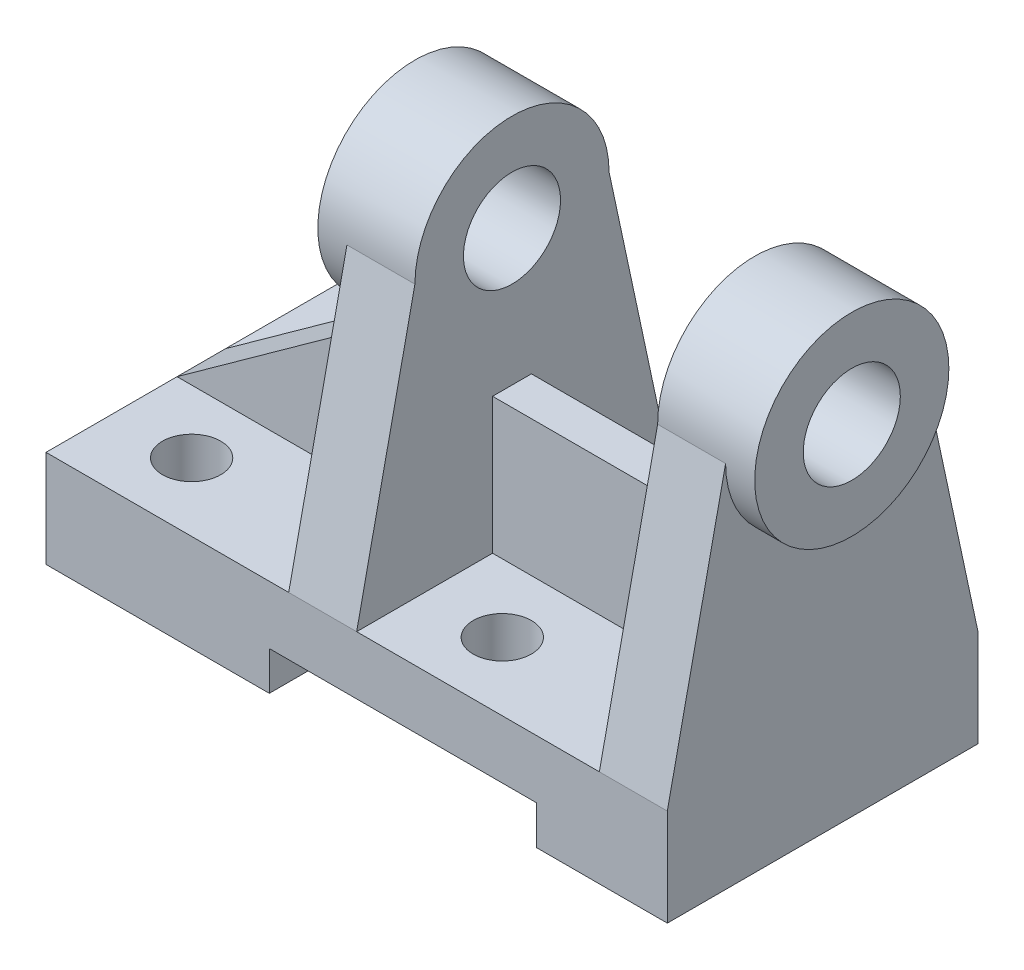
ISO-10303-21;
HEADER;
FILE_DESCRIPTION(('STEP AP214'),'2;1');
FILE_NAME('part.step','',(''),(''),'','','');
FILE_SCHEMA(('AUTOMOTIVE_DESIGN { 1 0 10303 214 1 1 1 1 }'));
ENDSEC;
DATA;
#1=APPLICATION_CONTEXT('core data for automotive mechanical design processes');
#2=APPLICATION_PROTOCOL_DEFINITION('international standard','automotive_design',2000,#1);
#3=PRODUCT_CONTEXT('',#1,'mechanical');
#4=PRODUCT('Part','Part','',(#3));
#5=PRODUCT_RELATED_PRODUCT_CATEGORY('part','',(#4));
#6=PRODUCT_DEFINITION_FORMATION('','',#4);
#7=PRODUCT_DEFINITION_CONTEXT('part definition',#1,'design');
#8=PRODUCT_DEFINITION('design','',#6,#7);
#9=PRODUCT_DEFINITION_SHAPE('','',#8);
#10=(LENGTH_UNIT() NAMED_UNIT(*) SI_UNIT(.MILLI.,.METRE.));
#11=(NAMED_UNIT(*) PLANE_ANGLE_UNIT() SI_UNIT($,.RADIAN.));
#12=(NAMED_UNIT(*) SI_UNIT($,.STERADIAN.) SOLID_ANGLE_UNIT());
#13=UNCERTAINTY_MEASURE_WITH_UNIT(LENGTH_MEASURE(1.E-05),#10,'distance_accuracy_value','');
#14=(GEOMETRIC_REPRESENTATION_CONTEXT(3) GLOBAL_UNCERTAINTY_ASSIGNED_CONTEXT((#13)) GLOBAL_UNIT_ASSIGNED_CONTEXT((#10,
#11,#12)) REPRESENTATION_CONTEXT('',''));
#15=CARTESIAN_POINT('',(0.,0.,0.));
#16=DIRECTION('',(0.,0.,1.));
#17=DIRECTION('',(1.,0.,0.));
#18=AXIS2_PLACEMENT_3D('',#15,#16,#17);
#19=CARTESIAN_POINT('',(0.,20.,0.));
#20=DIRECTION('',(0.,-1.,0.));
#21=DIRECTION('',(0.,0.,-1.));
#22=AXIS2_PLACEMENT_3D('',#19,#20,#21);
#23=PLANE('',#22);
#24=CARTESIAN_POINT('',(-48.,20.,-18.));
#25=DIRECTION('',(0.,1.,0.));
#26=DIRECTION('',(0.,0.,1.));
#27=AXIS2_PLACEMENT_3D('',#24,#25,#26);
#28=CIRCLE('',#27,6.);
#29=CARTESIAN_POINT('',(-48.,20.,-12.));
#30=VERTEX_POINT('',#29);
#31=EDGE_CURVE('E397',#30,#30,#28,.T.);
#32=ORIENTED_EDGE('',*,*,#31,.F.);
#33=EDGE_LOOP('',(#32));
#34=FACE_BOUND('',#33,.T.);
#35=DIRECTION('',(-1.,0.,0.));
#36=VECTOR('',#35,1.);
#37=CARTESIAN_POINT('',(0.,20.,-5.));
#38=LINE('',#37,#36);
#39=CARTESIAN_POINT('',(-14.,20.,-5.));
#40=VERTEX_POINT('',#39);
#41=CARTESIAN_POINT('',(-64.,20.,-5.));
#42=VERTEX_POINT('',#41);
#43=EDGE_CURVE('E188',#40,#42,#38,.T.);
#44=ORIENTED_EDGE('',*,*,#43,.F.);
#45=DIRECTION('',(0.,0.,1.));
#46=VECTOR('',#45,1.);
#47=CARTESIAN_POINT('',(-14.,20.,0.));
#48=LINE('',#47,#46);
#49=CARTESIAN_POINT('',(-14.,20.,-32.));
#50=VERTEX_POINT('',#49);
#51=EDGE_CURVE('E331',#50,#40,#48,.T.);
#52=ORIENTED_EDGE('',*,*,#51,.F.);
#53=DIRECTION('',(-1.,0.,0.));
#54=VECTOR('',#53,1.);
#55=CARTESIAN_POINT('',(-64.,20.,-32.));
#56=LINE('',#55,#54);
#57=CARTESIAN_POINT('',(-64.,20.,-32.));
#58=VERTEX_POINT('',#57);
#59=EDGE_CURVE('E219',#50,#58,#56,.T.);
#60=ORIENTED_EDGE('',*,*,#59,.T.);
#61=DIRECTION('',(0.,0.,1.));
#62=VECTOR('',#61,1.);
#63=CARTESIAN_POINT('',(-64.,20.,32.));
#64=LINE('',#63,#62);
#65=EDGE_CURVE('E213',#58,#42,#64,.T.);
#66=ORIENTED_EDGE('',*,*,#65,.T.);
#67=EDGE_LOOP('',(#44,#52,#60,#66));
#68=FACE_BOUND('',#67,.T.);
#69=ADVANCED_FACE('F37',(#34,#68),#23,.F.);
#70=CARTESIAN_POINT('',(-14.,0.,0.));
#71=DIRECTION('',(-1.,0.,0.));
#72=DIRECTION('',(0.,0.,-1.));
#73=AXIS2_PLACEMENT_3D('',#70,#71,#72);
#74=PLANE('',#73);
#75=DIRECTION('',(0.,1.,0.));
#76=VECTOR('',#75,1.);
#77=CARTESIAN_POINT('',(-14.,0.,5.));
#78=LINE('',#77,#76);
#79=CARTESIAN_POINT('',(-14.,20.,5.));
#80=VERTEX_POINT('',#79);
#81=CARTESIAN_POINT('',(-14.,56.,5.));
#82=VERTEX_POINT('',#81);
#83=EDGE_CURVE('E11',#80,#82,#78,.T.);
#84=ORIENTED_EDGE('',*,*,#83,.F.);
#85=CARTESIAN_POINT('',(-14.,20.,32.));
#86=VERTEX_POINT('',#85);
#87=EDGE_CURVE('E333',#80,#86,#48,.T.);
#88=ORIENTED_EDGE('',*,*,#87,.T.);
#89=DIRECTION('',(0.,-0.97780241407741,0.209529088730873));
#90=VECTOR('',#89,1.);
#91=CARTESIAN_POINT('',(-14.,7.43414634146341,34.6926829268293));
#92=LINE('',#91,#90);
#93=CARTESIAN_POINT('',(-14.,76.,20.));
#94=VERTEX_POINT('',#93);
#95=EDGE_CURVE('E327',#94,#86,#92,.T.);
#96=ORIENTED_EDGE('',*,*,#95,.F.);
#97=CARTESIAN_POINT('',(-14.,76.,0.));
#98=DIRECTION('',(-1.,0.,0.));
#99=DIRECTION('',(0.,0.,1.));
#100=AXIS2_PLACEMENT_3D('',#97,#98,#99);
#101=CIRCLE('',#100,20.);
#102=CARTESIAN_POINT('',(-14.,56.,0.));
#103=VERTEX_POINT('',#102);
#104=EDGE_CURVE('E249',#103,#94,#101,.T.);
#105=ORIENTED_EDGE('',*,*,#104,.F.);
#106=DIRECTION('',(0.,0.,1.));
#107=VECTOR('',#106,1.);
#108=CARTESIAN_POINT('',(-14.,56.,0.));
#109=LINE('',#108,#107);
#110=EDGE_CURVE('E46',#82,#103,#109,.F.);
#111=ORIENTED_EDGE('',*,*,#110,.F.);
#112=EDGE_LOOP('',(#84,#88,#96,#105,#111));
#113=FACE_BOUND('',#112,.T.);
#114=ADVANCED_FACE('F414',(#113),#74,.T.);
#115=CARTESIAN_POINT('',(16.,20.,-18.));
#116=DIRECTION('',(0.,1.,0.));
#117=DIRECTION('',(0.,0.,1.));
#118=AXIS2_PLACEMENT_3D('',#115,#116,#117);
#119=CIRCLE('',#118,6.);
#120=CARTESIAN_POINT('',(16.,20.,-12.));
#121=VERTEX_POINT('',#120);
#122=EDGE_CURVE('E387',#121,#121,#119,.T.);
#123=ORIENTED_EDGE('',*,*,#122,.F.);
#124=EDGE_LOOP('',(#123));
#125=FACE_BOUND('',#124,.T.);
#126=DIRECTION('',(-1.,0.,0.));
#127=VECTOR('',#126,1.);
#128=CARTESIAN_POINT('',(0.,20.,-4.));
#129=LINE('',#128,#127);
#130=CARTESIAN_POINT('',(50.,20.,-4.));
#131=VERTEX_POINT('',#130);
#132=CARTESIAN_POINT('',(0.,20.,-4.));
#133=VERTEX_POINT('',#132);
#134=EDGE_CURVE('E216',#131,#133,#129,.T.);
#135=ORIENTED_EDGE('',*,*,#134,.F.);
#136=DIRECTION('',(0.,0.,1.));
#137=VECTOR('',#136,1.);
#138=CARTESIAN_POINT('',(50.,20.,0.));
#139=LINE('',#138,#137);
#140=CARTESIAN_POINT('',(50.,20.,-32.));
#141=VERTEX_POINT('',#140);
#142=EDGE_CURVE('E253',#141,#131,#139,.T.);
#143=ORIENTED_EDGE('',*,*,#142,.F.);
#144=CARTESIAN_POINT('',(0.,20.,-32.));
#145=VERTEX_POINT('',#144);
#146=EDGE_CURVE('E244',#141,#145,#56,.T.);
#147=ORIENTED_EDGE('',*,*,#146,.T.);
#148=DIRECTION('',(0.,0.,1.));
#149=VECTOR('',#148,1.);
#150=CARTESIAN_POINT('',(0.,20.,0.));
#151=LINE('',#150,#149);
#152=EDGE_CURVE('E345',#145,#133,#151,.T.);
#153=ORIENTED_EDGE('',*,*,#152,.T.);
#154=EDGE_LOOP('',(#135,#143,#147,#153));
#155=FACE_BOUND('',#154,.T.);
#156=ADVANCED_FACE('F416',(#125,#155),#23,.F.);
#157=CARTESIAN_POINT('',(16.,20.,18.));
#158=DIRECTION('',(0.,1.,0.));
#159=DIRECTION('',(0.,0.,1.));
#160=AXIS2_PLACEMENT_3D('',#157,#158,#159);
#161=CIRCLE('',#160,6.);
#162=CARTESIAN_POINT('',(16.,20.,24.));
#163=VERTEX_POINT('',#162);
#164=EDGE_CURVE('E384',#163,#163,#161,.T.);
#165=ORIENTED_EDGE('',*,*,#164,.F.);
#166=EDGE_LOOP('',(#165));
#167=FACE_BOUND('',#166,.T.);
#168=DIRECTION('',(1.,0.,0.));
#169=VECTOR('',#168,1.);
#170=CARTESIAN_POINT('',(-64.,20.,32.));
#171=LINE('',#170,#169);
#172=CARTESIAN_POINT('',(0.,20.,32.));
#173=VERTEX_POINT('',#172);
#174=CARTESIAN_POINT('',(50.,20.,32.));
#175=VERTEX_POINT('',#174);
#176=EDGE_CURVE('E221',#173,#175,#171,.T.);
#177=ORIENTED_EDGE('',*,*,#176,.T.);
#178=CARTESIAN_POINT('',(50.,20.,4.));
#179=VERTEX_POINT('',#178);
#180=EDGE_CURVE('E250',#179,#175,#139,.T.);
#181=ORIENTED_EDGE('',*,*,#180,.F.);
#182=DIRECTION('',(1.,0.,0.));
#183=VECTOR('',#182,1.);
#184=CARTESIAN_POINT('',(0.,20.,4.));
#185=LINE('',#184,#183);
#186=CARTESIAN_POINT('',(0.,20.,4.));
#187=VERTEX_POINT('',#186);
#188=EDGE_CURVE('E365',#187,#179,#185,.T.);
#189=ORIENTED_EDGE('',*,*,#188,.F.);
#190=EDGE_CURVE('E347',#187,#173,#151,.T.);
#191=ORIENTED_EDGE('',*,*,#190,.T.);
#192=EDGE_LOOP('',(#177,#181,#189,#191));
#193=FACE_BOUND('',#192,.T.);
#194=ADVANCED_FACE('F427',(#167,#193),#23,.F.);
#195=CARTESIAN_POINT('',(50.,0.,0.));
#196=DIRECTION('',(1.,0.,0.));
#197=DIRECTION('',(0.,0.,-1.));
#198=AXIS2_PLACEMENT_3D('',#195,#196,#197);
#199=PLANE('',#198);
#200=CARTESIAN_POINT('',(50.,76.,0.));
#201=DIRECTION('',(1.,0.,0.));
#202=DIRECTION('',(0.,0.,-1.));
#203=AXIS2_PLACEMENT_3D('',#200,#201,#202);
#204=CIRCLE('',#203,10.);
#205=CARTESIAN_POINT('',(50.,76.,-10.));
#206=VERTEX_POINT('',#205);
#207=EDGE_CURVE('E261',#206,#206,#204,.T.);
#208=ORIENTED_EDGE('',*,*,#207,.T.);
#209=EDGE_LOOP('',(#208));
#210=FACE_BOUND('',#209,.T.);
#211=DIRECTION('',(0.,-0.97780241407741,0.209529088730873));
#212=VECTOR('',#211,1.);
#213=CARTESIAN_POINT('',(50.,7.43414634146341,34.6926829268293));
#214=LINE('',#213,#212);
#215=CARTESIAN_POINT('',(50.,76.,20.));
#216=VERTEX_POINT('',#215);
#217=EDGE_CURVE('E254',#216,#175,#214,.T.);
#218=ORIENTED_EDGE('',*,*,#217,.F.);
#219=CARTESIAN_POINT('',(50.,76.,0.));
#220=DIRECTION('',(1.,0.,0.));
#221=DIRECTION('',(0.,0.,-1.));
#222=AXIS2_PLACEMENT_3D('',#219,#220,#221);
#223=CIRCLE('',#222,20.);
#224=CARTESIAN_POINT('',(50.,76.,-20.));
#225=VERTEX_POINT('',#224);
#226=EDGE_CURVE('E259',#225,#216,#223,.T.);
#227=ORIENTED_EDGE('',*,*,#226,.F.);
#228=DIRECTION('',(0.,-0.97780241407741,-0.209529088730873));
#229=VECTOR('',#228,1.);
#230=CARTESIAN_POINT('',(50.,7.43414634146341,-34.6926829268293));
#231=LINE('',#230,#229);
#232=EDGE_CURVE('E276',#225,#141,#231,.T.);
#233=ORIENTED_EDGE('',*,*,#232,.T.);
#234=ORIENTED_EDGE('',*,*,#142,.T.);
#235=DIRECTION('',(0.,-1.,0.));
#236=VECTOR('',#235,1.);
#237=CARTESIAN_POINT('',(50.,48.,-4.));
#238=LINE('',#237,#236);
#239=CARTESIAN_POINT('',(50.,48.,-4.));
#240=VERTEX_POINT('',#239);
#241=EDGE_CURVE('E62',#240,#131,#238,.T.);
#242=ORIENTED_EDGE('',*,*,#241,.F.);
#243=DIRECTION('',(0.,0.,-1.));
#244=VECTOR('',#243,1.);
#245=CARTESIAN_POINT('',(50.,48.,4.));
#246=LINE('',#245,#244);
#247=CARTESIAN_POINT('',(50.,48.,4.));
#248=VERTEX_POINT('',#247);
#249=EDGE_CURVE('E368',#248,#240,#246,.T.);
#250=ORIENTED_EDGE('',*,*,#249,.F.);
#251=DIRECTION('',(0.,-1.,0.));
#252=VECTOR('',#251,1.);
#253=CARTESIAN_POINT('',(50.,48.,4.));
#254=LINE('',#253,#252);
#255=EDGE_CURVE('E362',#248,#179,#254,.T.);
#256=ORIENTED_EDGE('',*,*,#255,.T.);
#257=ORIENTED_EDGE('',*,*,#180,.T.);
#258=EDGE_LOOP('',(#218,#227,#233,#234,#242,#250,#256,#257));
#259=FACE_BOUND('',#258,.T.);
#260=ADVANCED_FACE('F441',(#210,#259),#199,.F.);
#261=CARTESIAN_POINT('',(0.,0.,0.));
#262=DIRECTION('',(-1.,0.,0.));
#263=DIRECTION('',(0.,0.,-1.));
#264=AXIS2_PLACEMENT_3D('',#261,#262,#263);
#265=PLANE('',#264);
#266=CARTESIAN_POINT('',(0.,76.,0.));
#267=DIRECTION('',(1.,0.,0.));
#268=DIRECTION('',(0.,0.,-1.));
#269=AXIS2_PLACEMENT_3D('',#266,#267,#268);
#270=CIRCLE('',#269,10.);
#271=CARTESIAN_POINT('',(0.,76.,-10.));
#272=VERTEX_POINT('',#271);
#273=EDGE_CURVE('E319',#272,#272,#270,.T.);
#274=ORIENTED_EDGE('',*,*,#273,.F.);
#275=EDGE_LOOP('',(#274));
#276=FACE_BOUND('',#275,.T.);
#277=DIRECTION('',(0.,-0.97780241407741,0.209529088730873));
#278=VECTOR('',#277,1.);
#279=CARTESIAN_POINT('',(0.,7.43414634146341,34.6926829268293));
#280=LINE('',#279,#278);
#281=CARTESIAN_POINT('',(0.,76.,20.));
#282=VERTEX_POINT('',#281);
#283=EDGE_CURVE('E342',#282,#173,#280,.T.);
#284=ORIENTED_EDGE('',*,*,#283,.T.);
#285=ORIENTED_EDGE('',*,*,#190,.F.);
#286=DIRECTION('',(0.,-1.,0.));
#287=VECTOR('',#286,1.);
#288=CARTESIAN_POINT('',(0.,48.,4.));
#289=LINE('',#288,#287);
#290=CARTESIAN_POINT('',(0.,48.,4.));
#291=VERTEX_POINT('',#290);
#292=EDGE_CURVE('E359',#291,#187,#289,.T.);
#293=ORIENTED_EDGE('',*,*,#292,.F.);
#294=DIRECTION('',(0.,0.,1.));
#295=VECTOR('',#294,1.);
#296=CARTESIAN_POINT('',(0.,48.,4.));
#297=LINE('',#296,#295);
#298=CARTESIAN_POINT('',(0.,48.,-4.));
#299=VERTEX_POINT('',#298);
#300=EDGE_CURVE('E373',#299,#291,#297,.T.);
#301=ORIENTED_EDGE('',*,*,#300,.F.);
#302=DIRECTION('',(0.,-1.,0.));
#303=VECTOR('',#302,1.);
#304=CARTESIAN_POINT('',(0.,48.,-4.));
#305=LINE('',#304,#303);
#306=EDGE_CURVE('E356',#299,#133,#305,.T.);
#307=ORIENTED_EDGE('',*,*,#306,.T.);
#308=ORIENTED_EDGE('',*,*,#152,.F.);
#309=DIRECTION('',(0.,-0.97780241407741,-0.209529088730873));
#310=VECTOR('',#309,1.);
#311=CARTESIAN_POINT('',(0.,7.43414634146341,-34.6926829268293));
#312=LINE('',#311,#310);
#313=CARTESIAN_POINT('',(0.,76.,-20.));
#314=VERTEX_POINT('',#313);
#315=EDGE_CURVE('E330',#314,#145,#312,.T.);
#316=ORIENTED_EDGE('',*,*,#315,.F.);
#317=CARTESIAN_POINT('',(0.,76.,0.));
#318=DIRECTION('',(1.,0.,0.));
#319=DIRECTION('',(0.,0.,-1.));
#320=AXIS2_PLACEMENT_3D('',#317,#318,#319);
#321=CIRCLE('',#320,20.);
#322=EDGE_CURVE('E340',#314,#282,#321,.T.);
#323=ORIENTED_EDGE('',*,*,#322,.T.);
#324=EDGE_LOOP('',(#284,#285,#293,#301,#307,#308,#316,#323));
#325=FACE_BOUND('',#324,.T.);
#326=ADVANCED_FACE('F437',(#276,#325),#265,.F.);
#327=CARTESIAN_POINT('',(64.,20.,32.));
#328=DIRECTION('',(-1.,0.,0.));
#329=DIRECTION('',(0.,0.,1.));
#330=AXIS2_PLACEMENT_3D('',#327,#328,#329);
#331=PLANE('',#330);
#332=DIRECTION('',(0.,0.,-1.));
#333=VECTOR('',#332,1.);
#334=CARTESIAN_POINT('',(64.,0.,32.));
#335=LINE('',#334,#333);
#336=CARTESIAN_POINT('',(64.,0.,32.));
#337=VERTEX_POINT('',#336);
#338=CARTESIAN_POINT('',(64.,0.,-32.));
#339=VERTEX_POINT('',#338);
#340=EDGE_CURVE('E233',#337,#339,#335,.T.);
#341=ORIENTED_EDGE('',*,*,#340,.T.);
#342=DIRECTION('',(0.,-1.,0.));
#343=VECTOR('',#342,1.);
#344=CARTESIAN_POINT('',(64.,20.,-32.));
#345=LINE('',#344,#343);
#346=CARTESIAN_POINT('',(64.,20.,-32.));
#347=VERTEX_POINT('',#346);
#348=EDGE_CURVE('E290',#347,#339,#345,.T.);
#349=ORIENTED_EDGE('',*,*,#348,.F.);
#350=DIRECTION('',(0.,-0.97780241407741,-0.209529088730873));
#351=VECTOR('',#350,1.);
#352=CARTESIAN_POINT('',(64.,7.43414634146341,-34.6926829268293));
#353=LINE('',#352,#351);
#354=CARTESIAN_POINT('',(64.,76.,-20.));
#355=VERTEX_POINT('',#354);
#356=EDGE_CURVE('E284',#355,#347,#353,.T.);
#357=ORIENTED_EDGE('',*,*,#356,.F.);
#358=CARTESIAN_POINT('',(64.,76.,0.));
#359=DIRECTION('',(1.,0.,0.));
#360=DIRECTION('',(0.,0.,-1.));
#361=AXIS2_PLACEMENT_3D('',#358,#359,#360);
#362=CIRCLE('',#361,20.);
#363=CARTESIAN_POINT('',(64.,76.,20.));
#364=VERTEX_POINT('',#363);
#365=EDGE_CURVE('E287',#364,#355,#362,.T.);
#366=ORIENTED_EDGE('',*,*,#365,.F.);
#367=DIRECTION('',(0.,-0.97780241407741,0.209529088730873));
#368=VECTOR('',#367,1.);
#369=CARTESIAN_POINT('',(64.,7.43414634146341,34.6926829268293));
#370=LINE('',#369,#368);
#371=CARTESIAN_POINT('',(64.,20.,32.));
#372=VERTEX_POINT('',#371);
#373=EDGE_CURVE('E279',#364,#372,#370,.T.);
#374=ORIENTED_EDGE('',*,*,#373,.T.);
#375=DIRECTION('',(0.,-1.,0.));
#376=VECTOR('',#375,1.);
#377=CARTESIAN_POINT('',(64.,20.,32.));
#378=LINE('',#377,#376);
#379=EDGE_CURVE('E457',#372,#337,#378,.T.);
#380=ORIENTED_EDGE('',*,*,#379,.T.);
#381=EDGE_LOOP('',(#341,#349,#357,#366,#374,#380));
#382=FACE_BOUND('',#381,.T.);
#383=ADVANCED_FACE('F39',(#382),#331,.F.);
#384=CARTESIAN_POINT('',(-48.,20.,18.));
#385=DIRECTION('',(0.,1.,0.));
#386=DIRECTION('',(0.,0.,1.));
#387=AXIS2_PLACEMENT_3D('',#384,#385,#386);
#388=CIRCLE('',#387,6.);
#389=CARTESIAN_POINT('',(-48.,20.,24.));
#390=VERTEX_POINT('',#389);
#391=EDGE_CURVE('E391',#390,#390,#388,.T.);
#392=ORIENTED_EDGE('',*,*,#391,.F.);
#393=EDGE_LOOP('',(#392));
#394=FACE_BOUND('',#393,.T.);
#395=ORIENTED_EDGE('',*,*,#87,.F.);
#396=DIRECTION('',(-1.,0.,0.));
#397=VECTOR('',#396,1.);
#398=CARTESIAN_POINT('',(0.,20.,5.));
#399=LINE('',#398,#397);
#400=CARTESIAN_POINT('',(-64.,20.,5.));
#401=VERTEX_POINT('',#400);
#402=EDGE_CURVE('E195',#80,#401,#399,.T.);
#403=ORIENTED_EDGE('',*,*,#402,.T.);
#404=CARTESIAN_POINT('',(-64.,20.,32.));
#405=VERTEX_POINT('',#404);
#406=EDGE_CURVE('E215',#401,#405,#64,.T.);
#407=ORIENTED_EDGE('',*,*,#406,.T.);
#408=EDGE_CURVE('E224',#405,#86,#171,.T.);
#409=ORIENTED_EDGE('',*,*,#408,.T.);
#410=EDGE_LOOP('',(#395,#403,#407,#409));
#411=FACE_BOUND('',#410,.T.);
#412=ADVANCED_FACE('F417',(#394,#411),#23,.F.);
#413=CARTESIAN_POINT('',(0.,0.,0.));
#414=DIRECTION('',(0.,-1.,0.));
#415=DIRECTION('',(0.,0.,-1.));
#416=AXIS2_PLACEMENT_3D('',#413,#414,#415);
#417=PLANE('',#416);
#418=CARTESIAN_POINT('',(-48.,0.,-18.));
#419=DIRECTION('',(0.,1.,0.));
#420=DIRECTION('',(0.,0.,1.));
#421=AXIS2_PLACEMENT_3D('',#418,#419,#420);
#422=CIRCLE('',#421,6.);
#423=CARTESIAN_POINT('',(-48.,0.,-12.));
#424=VERTEX_POINT('',#423);
#425=EDGE_CURVE('E394',#424,#424,#422,.T.);
#426=ORIENTED_EDGE('',*,*,#425,.T.);
#427=EDGE_LOOP('',(#426));
#428=FACE_BOUND('',#427,.T.);
#429=CARTESIAN_POINT('',(-48.,0.,18.));
#430=DIRECTION('',(0.,1.,0.));
#431=DIRECTION('',(0.,0.,1.));
#432=AXIS2_PLACEMENT_3D('',#429,#430,#431);
#433=CIRCLE('',#432,6.);
#434=CARTESIAN_POINT('',(-48.,0.,24.));
#435=VERTEX_POINT('',#434);
#436=EDGE_CURVE('E390',#435,#435,#433,.T.);
#437=ORIENTED_EDGE('',*,*,#436,.T.);
#438=EDGE_LOOP('',(#437));
#439=FACE_BOUND('',#438,.T.);
#440=DIRECTION('',(1.,0.,0.));
#441=VECTOR('',#440,1.);
#442=CARTESIAN_POINT('',(-64.,0.,32.));
#443=LINE('',#442,#441);
#444=CARTESIAN_POINT('',(-64.,0.,32.));
#445=VERTEX_POINT('',#444);
#446=CARTESIAN_POINT('',(-18.,0.,32.));
#447=VERTEX_POINT('',#446);
#448=EDGE_CURVE('E245',#445,#447,#443,.T.);
#449=ORIENTED_EDGE('',*,*,#448,.F.);
#450=DIRECTION('',(0.,0.,1.));
#451=VECTOR('',#450,1.);
#452=CARTESIAN_POINT('',(-64.,0.,32.));
#453=LINE('',#452,#451);
#454=CARTESIAN_POINT('',(-64.,0.,-32.));
#455=VERTEX_POINT('',#454);
#456=EDGE_CURVE('E508',#455,#445,#453,.T.);
#457=ORIENTED_EDGE('',*,*,#456,.F.);
#458=DIRECTION('',(-1.,0.,0.));
#459=VECTOR('',#458,1.);
#460=CARTESIAN_POINT('',(-64.,0.,-32.));
#461=LINE('',#460,#459);
#462=CARTESIAN_POINT('',(-18.,0.,-32.));
#463=VERTEX_POINT('',#462);
#464=EDGE_CURVE('E502',#463,#455,#461,.T.);
#465=ORIENTED_EDGE('',*,*,#464,.F.);
#466=DIRECTION('',(0.,0.,1.));
#467=VECTOR('',#466,1.);
#468=CARTESIAN_POINT('',(-18.,0.,-32.));
#469=LINE('',#468,#467);
#470=EDGE_CURVE('E517',#463,#447,#469,.T.);
#471=ORIENTED_EDGE('',*,*,#470,.T.);
#472=EDGE_LOOP('',(#449,#457,#465,#471));
#473=FACE_BOUND('',#472,.T.);
#474=ADVANCED_FACE('F403',(#428,#439,#473),#417,.T.);
#475=CARTESIAN_POINT('',(-64.,20.,-32.));
#476=DIRECTION('',(0.,0.,1.));
#477=DIRECTION('',(1.,0.,0.));
#478=AXIS2_PLACEMENT_3D('',#475,#476,#477);
#479=PLANE('',#478);
#480=DIRECTION('',(-1.,0.,0.));
#481=VECTOR('',#480,1.);
#482=CARTESIAN_POINT('',(-18.,8.,-32.));
#483=LINE('',#482,#481);
#484=CARTESIAN_POINT('',(37.,8.,-32.));
#485=VERTEX_POINT('',#484);
#486=CARTESIAN_POINT('',(-18.,8.,-32.));
#487=VERTEX_POINT('',#486);
#488=EDGE_CURVE('E535',#485,#487,#483,.T.);
#489=ORIENTED_EDGE('',*,*,#488,.T.);
#490=DIRECTION('',(0.,-1.,0.));
#491=VECTOR('',#490,1.);
#492=CARTESIAN_POINT('',(-18.,0.,-32.));
#493=LINE('',#492,#491);
#494=EDGE_CURVE('E513',#487,#463,#493,.T.);
#495=ORIENTED_EDGE('',*,*,#494,.T.);
#496=ORIENTED_EDGE('',*,*,#464,.T.);
#497=DIRECTION('',(0.,-1.,0.));
#498=VECTOR('',#497,1.);
#499=CARTESIAN_POINT('',(-64.,20.,-32.));
#500=LINE('',#499,#498);
#501=EDGE_CURVE('E483',#58,#455,#500,.T.);
#502=ORIENTED_EDGE('',*,*,#501,.F.);
#503=ORIENTED_EDGE('',*,*,#59,.F.);
#504=DIRECTION('',(-1.,0.,0.));
#505=VECTOR('',#504,1.);
#506=CARTESIAN_POINT('',(0.,20.,-32.));
#507=LINE('',#506,#505);
#508=EDGE_CURVE('E315',#145,#50,#507,.T.);
#509=ORIENTED_EDGE('',*,*,#508,.F.);
#510=ORIENTED_EDGE('',*,*,#146,.F.);
#511=EDGE_CURVE('E226',#347,#141,#56,.T.);
#512=ORIENTED_EDGE('',*,*,#511,.F.);
#513=ORIENTED_EDGE('',*,*,#348,.T.);
#514=CARTESIAN_POINT('',(37.,0.,-32.));
#515=VERTEX_POINT('',#514);
#516=EDGE_CURVE('E505',#339,#515,#461,.T.);
#517=ORIENTED_EDGE('',*,*,#516,.T.);
#518=DIRECTION('',(0.,1.,0.));
#519=VECTOR('',#518,1.);
#520=CARTESIAN_POINT('',(37.,0.,-32.));
#521=LINE('',#520,#519);
#522=EDGE_CURVE('E536',#515,#485,#521,.T.);
#523=ORIENTED_EDGE('',*,*,#522,.T.);
#524=EDGE_LOOP('',(#489,#495,#496,#502,#503,#509,#510,#512,#513,#517,#523));
#525=FACE_BOUND('',#524,.T.);
#526=ADVANCED_FACE('F435',(#525),#479,.F.);
#527=CARTESIAN_POINT('',(-64.,20.,32.));
#528=DIRECTION('',(1.,0.,0.));
#529=DIRECTION('',(0.,0.,-1.));
#530=AXIS2_PLACEMENT_3D('',#527,#528,#529);
#531=PLANE('',#530);
#532=ORIENTED_EDGE('',*,*,#406,.F.);
#533=DIRECTION('',(0.,0.,-1.));
#534=VECTOR('',#533,1.);
#535=CARTESIAN_POINT('',(-64.,20.,32.));
#536=LINE('',#535,#534);
#537=EDGE_CURVE('E202',#42,#401,#536,.F.);
#538=ORIENTED_EDGE('',*,*,#537,.F.);
#539=ORIENTED_EDGE('',*,*,#65,.F.);
#540=ORIENTED_EDGE('',*,*,#501,.T.);
#541=ORIENTED_EDGE('',*,*,#456,.T.);
#542=DIRECTION('',(0.,-1.,0.));
#543=VECTOR('',#542,1.);
#544=CARTESIAN_POINT('',(-64.,20.,32.));
#545=LINE('',#544,#543);
#546=EDGE_CURVE('E480',#405,#445,#545,.T.);
#547=ORIENTED_EDGE('',*,*,#546,.F.);
#548=EDGE_LOOP('',(#532,#538,#539,#540,#541,#547));
#549=FACE_BOUND('',#548,.T.);
#550=ADVANCED_FACE('F211',(#549),#531,.F.);
#551=CARTESIAN_POINT('',(-64.,20.,32.));
#552=DIRECTION('',(0.,0.,-1.));
#553=DIRECTION('',(-1.,0.,0.));
#554=AXIS2_PLACEMENT_3D('',#551,#552,#553);
#555=PLANE('',#554);
#556=ORIENTED_EDGE('',*,*,#448,.T.);
#557=DIRECTION('',(0.,-1.,0.));
#558=VECTOR('',#557,1.);
#559=CARTESIAN_POINT('',(-18.,0.,32.));
#560=LINE('',#559,#558);
#561=CARTESIAN_POINT('',(-18.,8.,32.));
#562=VERTEX_POINT('',#561);
#563=EDGE_CURVE('E268',#562,#447,#560,.T.);
#564=ORIENTED_EDGE('',*,*,#563,.F.);
#565=DIRECTION('',(-1.,0.,0.));
#566=VECTOR('',#565,1.);
#567=CARTESIAN_POINT('',(-18.,8.,32.));
#568=LINE('',#567,#566);
#569=CARTESIAN_POINT('',(37.,8.,32.));
#570=VERTEX_POINT('',#569);
#571=EDGE_CURVE('E525',#570,#562,#568,.T.);
#572=ORIENTED_EDGE('',*,*,#571,.F.);
#573=DIRECTION('',(0.,1.,0.));
#574=VECTOR('',#573,1.);
#575=CARTESIAN_POINT('',(37.,0.,32.));
#576=LINE('',#575,#574);
#577=CARTESIAN_POINT('',(37.,0.,32.));
#578=VERTEX_POINT('',#577);
#579=EDGE_CURVE('E523',#578,#570,#576,.T.);
#580=ORIENTED_EDGE('',*,*,#579,.F.);
#581=EDGE_CURVE('E509',#578,#337,#443,.T.);
#582=ORIENTED_EDGE('',*,*,#581,.T.);
#583=ORIENTED_EDGE('',*,*,#379,.F.);
#584=DIRECTION('',(1.,0.,0.));
#585=VECTOR('',#584,1.);
#586=CARTESIAN_POINT('',(50.,20.,32.));
#587=LINE('',#586,#585);
#588=EDGE_CURVE('E265',#175,#372,#587,.T.);
#589=ORIENTED_EDGE('',*,*,#588,.F.);
#590=ORIENTED_EDGE('',*,*,#176,.F.);
#591=DIRECTION('',(-1.,0.,0.));
#592=VECTOR('',#591,1.);
#593=CARTESIAN_POINT('',(0.,20.,32.));
#594=LINE('',#593,#592);
#595=EDGE_CURVE('E318',#173,#86,#594,.T.);
#596=ORIENTED_EDGE('',*,*,#595,.T.);
#597=ORIENTED_EDGE('',*,*,#408,.F.);
#598=ORIENTED_EDGE('',*,*,#546,.T.);
#599=EDGE_LOOP('',(#556,#564,#572,#580,#582,#583,#589,#590,#596,#597,#598));
#600=FACE_BOUND('',#599,.T.);
#601=ADVANCED_FACE('F456',(#600),#555,.F.);
#602=ORIENTED_EDGE('',*,*,#581,.F.);
#603=DIRECTION('',(0.,0.,1.));
#604=VECTOR('',#603,1.);
#605=CARTESIAN_POINT('',(37.,0.,-32.));
#606=LINE('',#605,#604);
#607=EDGE_CURVE('E506',#515,#578,#606,.T.);
#608=ORIENTED_EDGE('',*,*,#607,.F.);
#609=ORIENTED_EDGE('',*,*,#516,.F.);
#610=ORIENTED_EDGE('',*,*,#340,.F.);
#611=EDGE_LOOP('',(#602,#608,#609,#610));
#612=FACE_BOUND('',#611,.T.);
#613=ADVANCED_FACE('F436',(#612),#417,.T.);
#614=CARTESIAN_POINT('',(-18.,0.,-32.));
#615=DIRECTION('',(-1.,0.,0.));
#616=DIRECTION('',(0.,0.,1.));
#617=AXIS2_PLACEMENT_3D('',#614,#615,#616);
#618=PLANE('',#617);
#619=ORIENTED_EDGE('',*,*,#563,.T.);
#620=ORIENTED_EDGE('',*,*,#470,.F.);
#621=ORIENTED_EDGE('',*,*,#494,.F.);
#622=DIRECTION('',(0.,0.,1.));
#623=VECTOR('',#622,1.);
#624=CARTESIAN_POINT('',(-18.,8.,-32.));
#625=LINE('',#624,#623);
#626=EDGE_CURVE('E503',#487,#562,#625,.T.);
#627=ORIENTED_EDGE('',*,*,#626,.T.);
#628=EDGE_LOOP('',(#619,#620,#621,#627));
#629=FACE_BOUND('',#628,.T.);
#630=ADVANCED_FACE('F543',(#629),#618,.F.);
#631=CARTESIAN_POINT('',(-18.,8.,-32.));
#632=DIRECTION('',(0.,1.,0.));
#633=DIRECTION('',(0.,0.,1.));
#634=AXIS2_PLACEMENT_3D('',#631,#632,#633);
#635=PLANE('',#634);
#636=CARTESIAN_POINT('',(16.,8.,-18.));
#637=DIRECTION('',(0.,1.,0.));
#638=DIRECTION('',(0.,0.,1.));
#639=AXIS2_PLACEMENT_3D('',#636,#637,#638);
#640=CIRCLE('',#639,6.);
#641=CARTESIAN_POINT('',(16.,8.,-12.));
#642=VERTEX_POINT('',#641);
#643=EDGE_CURVE('E41',#642,#642,#640,.T.);
#644=ORIENTED_EDGE('',*,*,#643,.T.);
#645=EDGE_LOOP('',(#644));
#646=FACE_BOUND('',#645,.T.);
#647=CARTESIAN_POINT('',(16.,8.,18.));
#648=DIRECTION('',(0.,1.,0.));
#649=DIRECTION('',(0.,0.,1.));
#650=AXIS2_PLACEMENT_3D('',#647,#648,#649);
#651=CIRCLE('',#650,6.);
#652=CARTESIAN_POINT('',(16.,8.,24.));
#653=VERTEX_POINT('',#652);
#654=EDGE_CURVE('E206',#653,#653,#651,.T.);
#655=ORIENTED_EDGE('',*,*,#654,.T.);
#656=EDGE_LOOP('',(#655));
#657=FACE_BOUND('',#656,.T.);
#658=ORIENTED_EDGE('',*,*,#571,.T.);
#659=ORIENTED_EDGE('',*,*,#626,.F.);
#660=ORIENTED_EDGE('',*,*,#488,.F.);
#661=DIRECTION('',(0.,0.,1.));
#662=VECTOR('',#661,1.);
#663=CARTESIAN_POINT('',(37.,8.,-32.));
#664=LINE('',#663,#662);
#665=EDGE_CURVE('E533',#485,#570,#664,.T.);
#666=ORIENTED_EDGE('',*,*,#665,.T.);
#667=EDGE_LOOP('',(#658,#659,#660,#666));
#668=FACE_BOUND('',#667,.T.);
#669=ADVANCED_FACE('F541',(#646,#657,#668),#635,.F.);
#670=CARTESIAN_POINT('',(37.,0.,-32.));
#671=DIRECTION('',(1.,0.,0.));
#672=DIRECTION('',(0.,1.,0.));
#673=AXIS2_PLACEMENT_3D('',#670,#671,#672);
#674=PLANE('',#673);
#675=ORIENTED_EDGE('',*,*,#579,.T.);
#676=ORIENTED_EDGE('',*,*,#665,.F.);
#677=ORIENTED_EDGE('',*,*,#522,.F.);
#678=ORIENTED_EDGE('',*,*,#607,.T.);
#679=EDGE_LOOP('',(#675,#676,#677,#678));
#680=FACE_BOUND('',#679,.T.);
#681=ADVANCED_FACE('F539',(#680),#674,.F.);
#682=CARTESIAN_POINT('',(50.,7.43414634146341,-34.6926829268293));
#683=DIRECTION('',(0.,-0.209529088730873,0.977802414077409));
#684=DIRECTION('',(0.,-0.97780241407741,-0.209529088730873));
#685=AXIS2_PLACEMENT_3D('',#682,#683,#684);
#686=PLANE('',#685);
#687=ORIENTED_EDGE('',*,*,#356,.T.);
#688=ORIENTED_EDGE('',*,*,#511,.T.);
#689=ORIENTED_EDGE('',*,*,#232,.F.);
#690=DIRECTION('',(1.,0.,0.));
#691=VECTOR('',#690,1.);
#692=CARTESIAN_POINT('',(50.,76.,-20.));
#693=LINE('',#692,#691);
#694=EDGE_CURVE('E295',#225,#355,#693,.T.);
#695=ORIENTED_EDGE('',*,*,#694,.T.);
#696=EDGE_LOOP('',(#687,#688,#689,#695));
#697=FACE_BOUND('',#696,.T.);
#698=ADVANCED_FACE('F493',(#697),#686,.F.);
#699=CARTESIAN_POINT('',(50.,7.43414634146341,34.6926829268293));
#700=DIRECTION('',(0.,0.209529088730873,0.977802414077409));
#701=DIRECTION('',(0.,-0.97780241407741,0.209529088730873));
#702=AXIS2_PLACEMENT_3D('',#699,#700,#701);
#703=PLANE('',#702);
#704=ORIENTED_EDGE('',*,*,#373,.F.);
#705=DIRECTION('',(1.,0.,0.));
#706=VECTOR('',#705,1.);
#707=CARTESIAN_POINT('',(50.,76.,20.));
#708=LINE('',#707,#706);
#709=EDGE_CURVE('E269',#216,#364,#708,.T.);
#710=ORIENTED_EDGE('',*,*,#709,.F.);
#711=ORIENTED_EDGE('',*,*,#217,.T.);
#712=ORIENTED_EDGE('',*,*,#588,.T.);
#713=EDGE_LOOP('',(#704,#710,#711,#712));
#714=FACE_BOUND('',#713,.T.);
#715=ADVANCED_FACE('F461',(#714),#703,.T.);
#716=CARTESIAN_POINT('',(50.,76.,0.));
#717=DIRECTION('',(1.,0.,0.));
#718=DIRECTION('',(0.,0.,-1.));
#719=AXIS2_PLACEMENT_3D('',#716,#717,#718);
#720=CYLINDRICAL_SURFACE('',#719,20.);
#721=ORIENTED_EDGE('',*,*,#365,.T.);
#722=ORIENTED_EDGE('',*,*,#694,.F.);
#723=ORIENTED_EDGE('',*,*,#226,.T.);
#724=ORIENTED_EDGE('',*,*,#709,.T.);
#725=EDGE_LOOP('',(#721,#722,#723,#724));
#726=FACE_BOUND('',#725,.T.);
#727=CARTESIAN_POINT('',(70.,76.,0.));
#728=DIRECTION('',(1.,0.,0.));
#729=DIRECTION('',(0.,0.,-1.));
#730=AXIS2_PLACEMENT_3D('',#727,#728,#729);
#731=CIRCLE('',#730,20.);
#732=CARTESIAN_POINT('',(70.,76.,-20.));
#733=VERTEX_POINT('',#732);
#734=EDGE_CURVE('E302',#733,#733,#731,.T.);
#735=ORIENTED_EDGE('',*,*,#734,.F.);
#736=EDGE_LOOP('',(#735));
#737=FACE_BOUND('',#736,.T.);
#738=ADVANCED_FACE('F556',(#726,#737),#720,.T.);
#739=CARTESIAN_POINT('',(50.,76.,0.));
#740=DIRECTION('',(1.,0.,0.));
#741=DIRECTION('',(0.,0.,-1.));
#742=AXIS2_PLACEMENT_3D('',#739,#740,#741);
#743=CYLINDRICAL_SURFACE('',#742,10.);
#744=ORIENTED_EDGE('',*,*,#207,.F.);
#745=EDGE_LOOP('',(#744));
#746=FACE_BOUND('',#745,.T.);
#747=CARTESIAN_POINT('',(70.,76.,0.));
#748=DIRECTION('',(1.,0.,0.));
#749=DIRECTION('',(0.,0.,-1.));
#750=AXIS2_PLACEMENT_3D('',#747,#748,#749);
#751=CIRCLE('',#750,10.);
#752=CARTESIAN_POINT('',(70.,76.,-10.));
#753=VERTEX_POINT('',#752);
#754=EDGE_CURVE('E308',#753,#753,#751,.T.);
#755=ORIENTED_EDGE('',*,*,#754,.T.);
#756=EDGE_LOOP('',(#755));
#757=FACE_BOUND('',#756,.T.);
#758=ADVANCED_FACE('F559',(#746,#757),#743,.F.);
#759=CARTESIAN_POINT('',(70.,0.,0.));
#760=DIRECTION('',(1.,0.,0.));
#761=DIRECTION('',(0.,0.,-1.));
#762=AXIS2_PLACEMENT_3D('',#759,#760,#761);
#763=PLANE('',#762);
#764=ORIENTED_EDGE('',*,*,#754,.F.);
#765=EDGE_LOOP('',(#764));
#766=FACE_BOUND('',#765,.T.);
#767=ORIENTED_EDGE('',*,*,#734,.T.);
#768=EDGE_LOOP('',(#767));
#769=FACE_BOUND('',#768,.T.);
#770=ADVANCED_FACE('F564',(#766,#769),#763,.T.);
#771=CARTESIAN_POINT('',(0.,7.43414634146341,-34.6926829268293));
#772=DIRECTION('',(0.,0.209529088730873,-0.977802414077409));
#773=DIRECTION('',(0.,0.97780241407741,0.209529088730873));
#774=AXIS2_PLACEMENT_3D('',#771,#772,#773);
#775=PLANE('',#774);
#776=DIRECTION('',(0.,-0.97780241407741,-0.209529088730873));
#777=VECTOR('',#776,1.);
#778=CARTESIAN_POINT('',(-14.,7.43414634146341,-34.6926829268293));
#779=LINE('',#778,#777);
#780=CARTESIAN_POINT('',(-14.,76.,-20.));
#781=VERTEX_POINT('',#780);
#782=EDGE_CURVE('E334',#781,#50,#779,.T.);
#783=ORIENTED_EDGE('',*,*,#782,.F.);
#784=DIRECTION('',(-1.,0.,0.));
#785=VECTOR('',#784,1.);
#786=CARTESIAN_POINT('',(0.,76.,-20.));
#787=LINE('',#786,#785);
#788=EDGE_CURVE('E312',#314,#781,#787,.T.);
#789=ORIENTED_EDGE('',*,*,#788,.F.);
#790=ORIENTED_EDGE('',*,*,#315,.T.);
#791=ORIENTED_EDGE('',*,*,#508,.T.);
#792=EDGE_LOOP('',(#783,#789,#790,#791));
#793=FACE_BOUND('',#792,.T.);
#794=ADVANCED_FACE('F569',(#793),#775,.T.);
#795=CARTESIAN_POINT('',(0.,76.,0.));
#796=DIRECTION('',(-1.,0.,0.));
#797=DIRECTION('',(0.,0.,1.));
#798=AXIS2_PLACEMENT_3D('',#795,#796,#797);
#799=CYLINDRICAL_SURFACE('',#798,20.);
#800=ORIENTED_EDGE('',*,*,#788,.T.);
#801=EDGE_CURVE('E246',#781,#103,#101,.T.);
#802=ORIENTED_EDGE('',*,*,#801,.T.);
#803=ORIENTED_EDGE('',*,*,#104,.T.);
#804=DIRECTION('',(-1.,0.,0.));
#805=VECTOR('',#804,1.);
#806=CARTESIAN_POINT('',(0.,76.,20.));
#807=LINE('',#806,#805);
#808=EDGE_CURVE('E322',#282,#94,#807,.T.);
#809=ORIENTED_EDGE('',*,*,#808,.F.);
#810=ORIENTED_EDGE('',*,*,#322,.F.);
#811=EDGE_LOOP('',(#800,#802,#803,#809,#810));
#812=FACE_BOUND('',#811,.T.);
#813=CARTESIAN_POINT('',(-20.,76.,0.));
#814=DIRECTION('',(1.,0.,0.));
#815=DIRECTION('',(0.,0.,-1.));
#816=AXIS2_PLACEMENT_3D('',#813,#814,#815);
#817=CIRCLE('',#816,20.);
#818=CARTESIAN_POINT('',(-20.,76.,-20.));
#819=VERTEX_POINT('',#818);
#820=EDGE_CURVE('E337',#819,#819,#817,.T.);
#821=ORIENTED_EDGE('',*,*,#820,.T.);
#822=EDGE_LOOP('',(#821));
#823=FACE_BOUND('',#822,.T.);
#824=ADVANCED_FACE('F573',(#812,#823),#799,.T.);
#825=CARTESIAN_POINT('',(0.,7.43414634146341,34.6926829268293));
#826=DIRECTION('',(0.,-0.209529088730873,-0.977802414077409));
#827=DIRECTION('',(0.,0.97780241407741,-0.209529088730873));
#828=AXIS2_PLACEMENT_3D('',#825,#826,#827);
#829=PLANE('',#828);
#830=ORIENTED_EDGE('',*,*,#95,.T.);
#831=ORIENTED_EDGE('',*,*,#595,.F.);
#832=ORIENTED_EDGE('',*,*,#283,.F.);
#833=ORIENTED_EDGE('',*,*,#808,.T.);
#834=EDGE_LOOP('',(#830,#831,#832,#833));
#835=FACE_BOUND('',#834,.T.);
#836=ADVANCED_FACE('F474',(#835),#829,.F.);
#837=CARTESIAN_POINT('',(0.,76.,0.));
#838=DIRECTION('',(-1.,0.,0.));
#839=DIRECTION('',(0.,0.,1.));
#840=AXIS2_PLACEMENT_3D('',#837,#838,#839);
#841=CYLINDRICAL_SURFACE('',#840,10.);
#842=ORIENTED_EDGE('',*,*,#273,.T.);
#843=EDGE_LOOP('',(#842));
#844=FACE_BOUND('',#843,.T.);
#845=CARTESIAN_POINT('',(-20.,76.,0.));
#846=DIRECTION('',(1.,0.,0.));
#847=DIRECTION('',(0.,0.,-1.));
#848=AXIS2_PLACEMENT_3D('',#845,#846,#847);
#849=CIRCLE('',#848,10.);
#850=CARTESIAN_POINT('',(-20.,76.,-10.));
#851=VERTEX_POINT('',#850);
#852=EDGE_CURVE('E352',#851,#851,#849,.T.);
#853=ORIENTED_EDGE('',*,*,#852,.F.);
#854=EDGE_LOOP('',(#853));
#855=FACE_BOUND('',#854,.T.);
#856=ADVANCED_FACE('F577',(#844,#855),#841,.F.);
#857=CARTESIAN_POINT('',(-14.,56.,-5.));
#858=VERTEX_POINT('',#857);
#859=EDGE_CURVE('E205',#103,#858,#109,.F.);
#860=ORIENTED_EDGE('',*,*,#859,.F.);
#861=ORIENTED_EDGE('',*,*,#801,.F.);
#862=ORIENTED_EDGE('',*,*,#782,.T.);
#863=ORIENTED_EDGE('',*,*,#51,.T.);
#864=DIRECTION('',(0.,1.,0.));
#865=VECTOR('',#864,1.);
#866=CARTESIAN_POINT('',(-14.,0.,-5.));
#867=LINE('',#866,#865);
#868=EDGE_CURVE('E191',#40,#858,#867,.T.);
#869=ORIENTED_EDGE('',*,*,#868,.T.);
#870=EDGE_LOOP('',(#860,#861,#862,#863,#869));
#871=FACE_BOUND('',#870,.T.);
#872=ADVANCED_FACE('F423',(#871),#74,.T.);
#873=CARTESIAN_POINT('',(-20.,0.,0.));
#874=DIRECTION('',(-1.,0.,0.));
#875=DIRECTION('',(0.,0.,-1.));
#876=AXIS2_PLACEMENT_3D('',#873,#874,#875);
#877=PLANE('',#876);
#878=ORIENTED_EDGE('',*,*,#852,.T.);
#879=EDGE_LOOP('',(#878));
#880=FACE_BOUND('',#879,.T.);
#881=ORIENTED_EDGE('',*,*,#820,.F.);
#882=EDGE_LOOP('',(#881));
#883=FACE_BOUND('',#882,.T.);
#884=ADVANCED_FACE('F585',(#880,#883),#877,.T.);
#885=CARTESIAN_POINT('',(0.,48.,-4.));
#886=DIRECTION('',(0.,0.,1.));
#887=DIRECTION('',(1.,0.,0.));
#888=AXIS2_PLACEMENT_3D('',#885,#886,#887);
#889=PLANE('',#888);
#890=ORIENTED_EDGE('',*,*,#134,.T.);
#891=ORIENTED_EDGE('',*,*,#306,.F.);
#892=DIRECTION('',(-1.,0.,0.));
#893=VECTOR('',#892,1.);
#894=CARTESIAN_POINT('',(0.,48.,-4.));
#895=LINE('',#894,#893);
#896=EDGE_CURVE('E376',#240,#299,#895,.T.);
#897=ORIENTED_EDGE('',*,*,#896,.F.);
#898=ORIENTED_EDGE('',*,*,#241,.T.);
#899=EDGE_LOOP('',(#890,#891,#897,#898));
#900=FACE_BOUND('',#899,.T.);
#901=ADVANCED_FACE('F592',(#900),#889,.F.);
#902=CARTESIAN_POINT('',(0.,48.,4.));
#903=DIRECTION('',(0.,0.,-1.));
#904=DIRECTION('',(-1.,0.,0.));
#905=AXIS2_PLACEMENT_3D('',#902,#903,#904);
#906=PLANE('',#905);
#907=ORIENTED_EDGE('',*,*,#188,.T.);
#908=ORIENTED_EDGE('',*,*,#255,.F.);
#909=DIRECTION('',(1.,0.,0.));
#910=VECTOR('',#909,1.);
#911=CARTESIAN_POINT('',(0.,48.,4.));
#912=LINE('',#911,#910);
#913=EDGE_CURVE('E364',#291,#248,#912,.T.);
#914=ORIENTED_EDGE('',*,*,#913,.F.);
#915=ORIENTED_EDGE('',*,*,#292,.T.);
#916=EDGE_LOOP('',(#907,#908,#914,#915));
#917=FACE_BOUND('',#916,.T.);
#918=ADVANCED_FACE('F466',(#917),#906,.F.);
#919=CARTESIAN_POINT('',(0.,48.,0.));
#920=DIRECTION('',(0.,-1.,0.));
#921=DIRECTION('',(0.,0.,-1.));
#922=AXIS2_PLACEMENT_3D('',#919,#920,#921);
#923=PLANE('',#922);
#924=ORIENTED_EDGE('',*,*,#249,.T.);
#925=ORIENTED_EDGE('',*,*,#896,.T.);
#926=ORIENTED_EDGE('',*,*,#300,.T.);
#927=ORIENTED_EDGE('',*,*,#913,.T.);
#928=EDGE_LOOP('',(#924,#925,#926,#927));
#929=FACE_BOUND('',#928,.T.);
#930=ADVANCED_FACE('F599',(#929),#923,.F.);
#931=CARTESIAN_POINT('',(2.99998749999997,48.,5.));
#932=DIRECTION('',(0.,0.,1.));
#933=DIRECTION('',(1.,0.,0.));
#934=AXIS2_PLACEMENT_3D('',#931,#932,#933);
#935=PLANE('',#934);
#936=ORIENTED_EDGE('',*,*,#402,.F.);
#937=ORIENTED_EDGE('',*,*,#83,.T.);
#938=DIRECTION('',(0.811534341451495,0.584304725845076,0.));
#939=VECTOR('',#938,1.);
#940=CARTESIAN_POINT('',(-64.,20.,5.));
#941=LINE('',#940,#939);
#942=EDGE_CURVE('E196',#401,#82,#941,.T.);
#943=ORIENTED_EDGE('',*,*,#942,.F.);
#944=EDGE_LOOP('',(#936,#937,#943));
#945=FACE_BOUND('',#944,.T.);
#946=ADVANCED_FACE('F602',(#945),#935,.T.);
#947=CARTESIAN_POINT('',(2.99998749999997,48.,-5.));
#948=DIRECTION('',(0.,0.,1.));
#949=DIRECTION('',(1.,0.,0.));
#950=AXIS2_PLACEMENT_3D('',#947,#948,#949);
#951=PLANE('',#950);
#952=ORIENTED_EDGE('',*,*,#868,.F.);
#953=ORIENTED_EDGE('',*,*,#43,.T.);
#954=DIRECTION('',(0.811534341451495,0.584304725845076,0.));
#955=VECTOR('',#954,1.);
#956=CARTESIAN_POINT('',(-64.,20.,-5.));
#957=LINE('',#956,#955);
#958=EDGE_CURVE('E54',#42,#858,#957,.T.);
#959=ORIENTED_EDGE('',*,*,#958,.T.);
#960=EDGE_LOOP('',(#952,#953,#959));
#961=FACE_BOUND('',#960,.T.);
#962=ADVANCED_FACE('F189',(#961),#951,.F.);
#963=CARTESIAN_POINT('',(-64.,20.,0.));
#964=DIRECTION('',(0.584304725845076,-0.811534341451495,0.));
#965=DIRECTION('',(0.811534341451495,0.584304725845076,0.));
#966=AXIS2_PLACEMENT_3D('',#963,#964,#965);
#967=PLANE('',#966);
#968=ORIENTED_EDGE('',*,*,#958,.F.);
#969=ORIENTED_EDGE('',*,*,#537,.T.);
#970=ORIENTED_EDGE('',*,*,#942,.T.);
#971=ORIENTED_EDGE('',*,*,#110,.T.);
#972=ORIENTED_EDGE('',*,*,#859,.T.);
#973=EDGE_LOOP('',(#968,#969,#970,#971,#972));
#974=FACE_BOUND('',#973,.T.);
#975=ADVANCED_FACE('F200',(#974),#967,.F.);
#976=CARTESIAN_POINT('',(16.,0.,18.));
#977=DIRECTION('',(0.,1.,0.));
#978=DIRECTION('',(0.,0.,1.));
#979=AXIS2_PLACEMENT_3D('',#976,#977,#978);
#980=CYLINDRICAL_SURFACE('',#979,6.);
#981=ORIENTED_EDGE('',*,*,#164,.T.);
#982=EDGE_LOOP('',(#981));
#983=FACE_BOUND('',#982,.T.);
#984=ORIENTED_EDGE('',*,*,#654,.F.);
#985=EDGE_LOOP('',(#984));
#986=FACE_BOUND('',#985,.T.);
#987=ADVANCED_FACE('F606',(#983,#986),#980,.F.);
#988=CARTESIAN_POINT('',(16.,0.,-18.));
#989=DIRECTION('',(0.,1.,0.));
#990=DIRECTION('',(0.,0.,1.));
#991=AXIS2_PLACEMENT_3D('',#988,#989,#990);
#992=CYLINDRICAL_SURFACE('',#991,6.);
#993=ORIENTED_EDGE('',*,*,#122,.T.);
#994=EDGE_LOOP('',(#993));
#995=FACE_BOUND('',#994,.T.);
#996=ORIENTED_EDGE('',*,*,#643,.F.);
#997=EDGE_LOOP('',(#996));
#998=FACE_BOUND('',#997,.T.);
#999=ADVANCED_FACE('F614',(#995,#998),#992,.F.);
#1000=CARTESIAN_POINT('',(-48.,0.,18.));
#1001=DIRECTION('',(0.,1.,0.));
#1002=DIRECTION('',(0.,0.,1.));
#1003=AXIS2_PLACEMENT_3D('',#1000,#1001,#1002);
#1004=CYLINDRICAL_SURFACE('',#1003,6.);
#1005=ORIENTED_EDGE('',*,*,#436,.F.);
#1006=EDGE_LOOP('',(#1005));
#1007=FACE_BOUND('',#1006,.T.);
#1008=ORIENTED_EDGE('',*,*,#391,.T.);
#1009=EDGE_LOOP('',(#1008));
#1010=FACE_BOUND('',#1009,.T.);
#1011=ADVANCED_FACE('F409',(#1007,#1010),#1004,.F.);
#1012=CARTESIAN_POINT('',(-48.,0.,-18.));
#1013=DIRECTION('',(0.,1.,0.));
#1014=DIRECTION('',(0.,0.,1.));
#1015=AXIS2_PLACEMENT_3D('',#1012,#1013,#1014);
#1016=CYLINDRICAL_SURFACE('',#1015,6.);
#1017=ORIENTED_EDGE('',*,*,#425,.F.);
#1018=EDGE_LOOP('',(#1017));
#1019=FACE_BOUND('',#1018,.T.);
#1020=ORIENTED_EDGE('',*,*,#31,.T.);
#1021=EDGE_LOOP('',(#1020));
#1022=FACE_BOUND('',#1021,.T.);
#1023=ADVANCED_FACE('F406',(#1019,#1022),#1016,.F.);
#1024=CLOSED_SHELL('',(#69,#114,#156,#194,#260,#326,#383,#412,#474,#526,#550,#601,#613,#630,
#669,#681,#698,#715,#738,#758,#770,#794,#824,#836,#856,#872,#884,#901,#918,#930,#946,#962,#975,
#987,#999,#1011,#1023));
#1025=MANIFOLD_SOLID_BREP('B2',#1024);
#1026=ADVANCED_BREP_SHAPE_REPRESENTATION('',(#18,#1025),#14);
#1027=SHAPE_DEFINITION_REPRESENTATION(#9,#1026);
ENDSEC;
END-ISO-10303-21;
